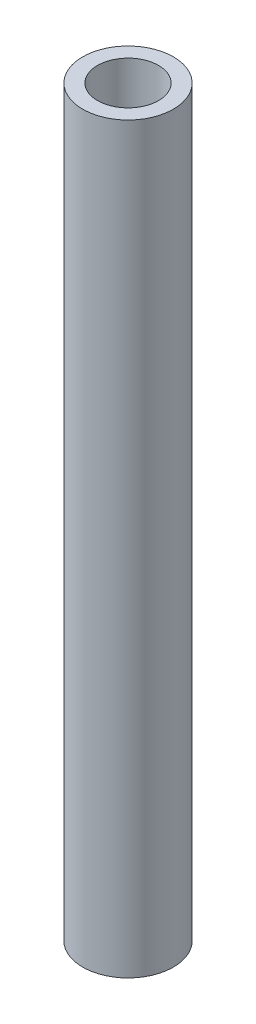
ISO-10303-21;
HEADER;
FILE_DESCRIPTION(('STEP AP214'),'2;1');
FILE_NAME('part.step','',(''),(''),'','','');
FILE_SCHEMA(('AUTOMOTIVE_DESIGN { 1 0 10303 214 1 1 1 1 }'));
ENDSEC;
DATA;
#1=APPLICATION_CONTEXT('core data for automotive mechanical design processes');
#2=APPLICATION_PROTOCOL_DEFINITION('international standard','automotive_design',2000,#1);
#3=PRODUCT_CONTEXT('',#1,'mechanical');
#4=PRODUCT('Part','Part','',(#3));
#5=PRODUCT_RELATED_PRODUCT_CATEGORY('part','',(#4));
#6=PRODUCT_DEFINITION_FORMATION('','',#4);
#7=PRODUCT_DEFINITION_CONTEXT('part definition',#1,'design');
#8=PRODUCT_DEFINITION('design','',#6,#7);
#9=PRODUCT_DEFINITION_SHAPE('','',#8);
#10=(LENGTH_UNIT() NAMED_UNIT(*) SI_UNIT(.MILLI.,.METRE.));
#11=(NAMED_UNIT(*) PLANE_ANGLE_UNIT() SI_UNIT($,.RADIAN.));
#12=(NAMED_UNIT(*) SI_UNIT($,.STERADIAN.) SOLID_ANGLE_UNIT());
#13=UNCERTAINTY_MEASURE_WITH_UNIT(LENGTH_MEASURE(1.E-05),#10,'distance_accuracy_value','');
#14=(GEOMETRIC_REPRESENTATION_CONTEXT(3) GLOBAL_UNCERTAINTY_ASSIGNED_CONTEXT((#13)) GLOBAL_UNIT_ASSIGNED_CONTEXT((#10,
#11,#12)) REPRESENTATION_CONTEXT('',''));
#15=CARTESIAN_POINT('',(0.,0.,0.));
#16=DIRECTION('',(0.,0.,1.));
#17=DIRECTION('',(1.,0.,0.));
#18=AXIS2_PLACEMENT_3D('',#15,#16,#17);
#19=CARTESIAN_POINT('',(0.,12.065,0.));
#20=DIRECTION('',(0.,1.,0.));
#21=DIRECTION('',(0.,0.,1.));
#22=AXIS2_PLACEMENT_3D('',#19,#20,#21);
#23=PLANE('',#22);
#24=CARTESIAN_POINT('',(0.,12.065,0.));
#25=DIRECTION('',(0.,1.,0.));
#26=DIRECTION('',(0.,0.,1.));
#27=AXIS2_PLACEMENT_3D('',#24,#25,#26);
#28=CIRCLE('',#27,0.7366);
#29=CARTESIAN_POINT('',(0.,12.065,-0.7366));
#30=VERTEX_POINT('',#29);
#31=EDGE_CURVE('E10',#30,#30,#28,.T.);
#32=ORIENTED_EDGE('',*,*,#31,.T.);
#33=EDGE_LOOP('',(#32));
#34=FACE_BOUND('',#33,.T.);
#35=CARTESIAN_POINT('',(0.,12.065,0.));
#36=DIRECTION('',(0.,1.,0.));
#37=DIRECTION('',(0.,0.,1.));
#38=AXIS2_PLACEMENT_3D('',#35,#36,#37);
#39=CIRCLE('',#38,0.4953);
#40=CARTESIAN_POINT('',(0.,12.065,0.4953));
#41=VERTEX_POINT('',#40);
#42=EDGE_CURVE('E42',#41,#41,#39,.T.);
#43=ORIENTED_EDGE('',*,*,#42,.F.);
#44=EDGE_LOOP('',(#43));
#45=FACE_BOUND('',#44,.T.);
#46=ADVANCED_FACE('F31',(#34,#45),#23,.T.);
#47=CARTESIAN_POINT('',(0.,0.,0.));
#48=DIRECTION('',(0.,1.,0.));
#49=DIRECTION('',(0.,0.,1.));
#50=AXIS2_PLACEMENT_3D('',#47,#48,#49);
#51=PLANE('',#50);
#52=CARTESIAN_POINT('',(0.,0.,0.));
#53=DIRECTION('',(0.,1.,0.));
#54=DIRECTION('',(0.,0.,1.));
#55=AXIS2_PLACEMENT_3D('',#52,#53,#54);
#56=CIRCLE('',#55,0.7366);
#57=CARTESIAN_POINT('',(0.,0.,-0.7366));
#58=VERTEX_POINT('',#57);
#59=EDGE_CURVE('E35',#58,#58,#56,.T.);
#60=ORIENTED_EDGE('',*,*,#59,.F.);
#61=EDGE_LOOP('',(#60));
#62=FACE_BOUND('',#61,.T.);
#63=CARTESIAN_POINT('',(0.,0.,0.));
#64=DIRECTION('',(0.,1.,0.));
#65=DIRECTION('',(0.,0.,1.));
#66=AXIS2_PLACEMENT_3D('',#63,#64,#65);
#67=CIRCLE('',#66,0.4953);
#68=CARTESIAN_POINT('',(0.,0.,0.4953));
#69=VERTEX_POINT('',#68);
#70=EDGE_CURVE('E44',#69,#69,#67,.T.);
#71=ORIENTED_EDGE('',*,*,#70,.T.);
#72=EDGE_LOOP('',(#71));
#73=FACE_BOUND('',#72,.T.);
#74=ADVANCED_FACE('F54',(#62,#73),#51,.F.);
#75=CARTESIAN_POINT('',(0.,12.065,0.));
#76=DIRECTION('',(0.,-1.,0.));
#77=DIRECTION('',(0.,0.,-1.));
#78=AXIS2_PLACEMENT_3D('',#75,#76,#77);
#79=CYLINDRICAL_SURFACE('',#78,0.7366);
#80=CARTESIAN_POINT('',(0.,12.065,-0.7366));
#81=CARTESIAN_POINT('',(0.,11.9393229166667,-0.7366));
#82=CARTESIAN_POINT('',(0.,11.8136458333333,-0.7366));
#83=CARTESIAN_POINT('',(0.,11.5622916666667,-0.7366));
#84=CARTESIAN_POINT('',(0.,11.4366145833333,-0.7366));
#85=CARTESIAN_POINT('',(0.,11.1852604166667,-0.7366));
#86=CARTESIAN_POINT('',(0.,11.0595833333333,-0.7366));
#87=CARTESIAN_POINT('',(0.,10.8082291666667,-0.7366));
#88=CARTESIAN_POINT('',(0.,10.6825520833333,-0.7366));
#89=CARTESIAN_POINT('',(0.,10.4311979166667,-0.7366));
#90=CARTESIAN_POINT('',(0.,10.3055208333333,-0.7366));
#91=CARTESIAN_POINT('',(0.,10.0541666666667,-0.7366));
#92=CARTESIAN_POINT('',(0.,9.92848958333333,-0.7366));
#93=CARTESIAN_POINT('',(0.,9.67713541666667,-0.7366));
#94=CARTESIAN_POINT('',(0.,9.55145833333333,-0.7366));
#95=CARTESIAN_POINT('',(0.,9.30010416666667,-0.7366));
#96=CARTESIAN_POINT('',(0.,9.17442708333333,-0.7366));
#97=CARTESIAN_POINT('',(0.,8.92307291666667,-0.7366));
#98=CARTESIAN_POINT('',(0.,8.79739583333333,-0.7366));
#99=CARTESIAN_POINT('',(0.,8.54604166666667,-0.7366));
#100=CARTESIAN_POINT('',(0.,8.42036458333333,-0.7366));
#101=CARTESIAN_POINT('',(0.,8.16901041666667,-0.7366));
#102=CARTESIAN_POINT('',(0.,8.04333333333333,-0.7366));
#103=CARTESIAN_POINT('',(0.,7.79197916666666,-0.7366));
#104=CARTESIAN_POINT('',(0.,7.66630208333333,-0.7366));
#105=CARTESIAN_POINT('',(0.,7.41494791666666,-0.7366));
#106=CARTESIAN_POINT('',(0.,7.28927083333333,-0.7366));
#107=CARTESIAN_POINT('',(0.,7.03791666666667,-0.7366));
#108=CARTESIAN_POINT('',(0.,6.91223958333333,-0.7366));
#109=CARTESIAN_POINT('',(0.,6.66088541666667,-0.7366));
#110=CARTESIAN_POINT('',(0.,6.53520833333333,-0.7366));
#111=CARTESIAN_POINT('',(0.,6.28385416666667,-0.7366));
#112=CARTESIAN_POINT('',(0.,6.15817708333333,-0.7366));
#113=CARTESIAN_POINT('',(0.,5.90682291666667,-0.7366));
#114=CARTESIAN_POINT('',(0.,5.78114583333333,-0.7366));
#115=CARTESIAN_POINT('',(0.,5.52979166666667,-0.7366));
#116=CARTESIAN_POINT('',(0.,5.40411458333333,-0.7366));
#117=CARTESIAN_POINT('',(0.,5.15276041666666,-0.7366));
#118=CARTESIAN_POINT('',(0.,5.02708333333333,-0.7366));
#119=CARTESIAN_POINT('',(0.,4.77572916666667,-0.7366));
#120=CARTESIAN_POINT('',(0.,4.65005208333333,-0.7366));
#121=CARTESIAN_POINT('',(0.,4.39869791666667,-0.7366));
#122=CARTESIAN_POINT('',(0.,4.27302083333333,-0.7366));
#123=CARTESIAN_POINT('',(0.,4.02166666666667,-0.7366));
#124=CARTESIAN_POINT('',(0.,3.89598958333333,-0.7366));
#125=CARTESIAN_POINT('',(0.,3.64463541666667,-0.7366));
#126=CARTESIAN_POINT('',(0.,3.51895833333333,-0.7366));
#127=CARTESIAN_POINT('',(0.,3.26760416666666,-0.7366));
#128=CARTESIAN_POINT('',(0.,3.14192708333333,-0.7366));
#129=CARTESIAN_POINT('',(0.,2.89057291666666,-0.7366));
#130=CARTESIAN_POINT('',(0.,2.76489583333333,-0.7366));
#131=CARTESIAN_POINT('',(0.,2.51354166666667,-0.7366));
#132=CARTESIAN_POINT('',(0.,2.38786458333333,-0.7366));
#133=CARTESIAN_POINT('',(0.,2.13651041666667,-0.7366));
#134=CARTESIAN_POINT('',(0.,2.01083333333333,-0.7366));
#135=CARTESIAN_POINT('',(0.,1.75947916666667,-0.7366));
#136=CARTESIAN_POINT('',(0.,1.63380208333333,-0.7366));
#137=CARTESIAN_POINT('',(0.,1.38244791666667,-0.7366));
#138=CARTESIAN_POINT('',(0.,1.25677083333333,-0.7366));
#139=CARTESIAN_POINT('',(0.,1.00541666666666,-0.7366));
#140=CARTESIAN_POINT('',(0.,0.879739583333331,-0.7366));
#141=CARTESIAN_POINT('',(0.,0.628385416666665,-0.7366));
#142=CARTESIAN_POINT('',(0.,0.502708333333331,-0.7366));
#143=CARTESIAN_POINT('',(0.,0.251354166666665,-0.7366));
#144=CARTESIAN_POINT('',(0.,0.125677083333331,-0.7366));
#145=CARTESIAN_POINT('',(0.,0.,-0.7366));
#146=B_SPLINE_CURVE_WITH_KNOTS('',3,(#80,#81,#82,#83,#84,#85,#86,#87,#88,#89,#90,#91,#92,#93,
#94,#95,#96,#97,#98,#99,#100,#101,#102,#103,#104,#105,#106,#107,#108,#109,#110,#111,#112,#113,
#114,#115,#116,#117,#118,#119,#120,#121,#122,#123,#124,#125,#126,#127,#128,#129,#130,#131,#132,
#133,#134,#135,#136,#137,#138,#139,#140,#141,#142,#143,#144,#145),.UNSPECIFIED.,.F.,.F.,(4,2,2,
2,2,2,2,2,2,2,2,2,2,2,2,2,2,2,2,2,2,2,2,2,2,2,2,2,2,2,2,2,4),(0.,0.37703125,0.7540625,
1.13109375,1.508125,1.88515625,2.2621875,2.63921875,3.01625,3.39328125,3.7703125,4.14734375,
4.524375,4.90140625,5.2784375,5.65546875,6.0325,6.40953125,6.7865625,7.16359375,7.540625,
7.91765625,8.2946875,8.67171875,9.04875,9.42578125,9.8028125,10.17984375,10.556875,10.93390625,
11.3109375,11.68796875,12.065),.UNSPECIFIED.);
#147=EDGE_CURVE('BSEAM33',#30,#58,#146,.T.);
#148=ORIENTED_EDGE('',*,*,#31,.F.);
#149=ORIENTED_EDGE('',*,*,#59,.T.);
#150=ORIENTED_EDGE('',*,*,#147,.T.);
#151=ORIENTED_EDGE('',*,*,#147,.F.);
#152=EDGE_LOOP('',(#148,#150,#149,#151));
#153=FACE_BOUND('',#152,.T.);
#154=ADVANCED_FACE('F33',(#153),#79,.T.);
#155=CARTESIAN_POINT('',(0.,12.065,0.));
#156=DIRECTION('',(0.,-1.,0.));
#157=DIRECTION('',(0.,0.,-1.));
#158=AXIS2_PLACEMENT_3D('',#155,#156,#157);
#159=CYLINDRICAL_SURFACE('',#158,0.4953);
#160=ORIENTED_EDGE('',*,*,#42,.T.);
#161=EDGE_LOOP('',(#160));
#162=FACE_BOUND('',#161,.T.);
#163=ORIENTED_EDGE('',*,*,#70,.F.);
#164=EDGE_LOOP('',(#163));
#165=FACE_BOUND('',#164,.T.);
#166=ADVANCED_FACE('F50',(#162,#165),#159,.F.);
#167=CLOSED_SHELL('',(#46,#74,#154,#166));
#168=MANIFOLD_SOLID_BREP('B2',#167);
#169=ADVANCED_BREP_SHAPE_REPRESENTATION('',(#18,#168),#14);
#170=SHAPE_DEFINITION_REPRESENTATION(#9,#169);
ENDSEC;
END-ISO-10303-21;
